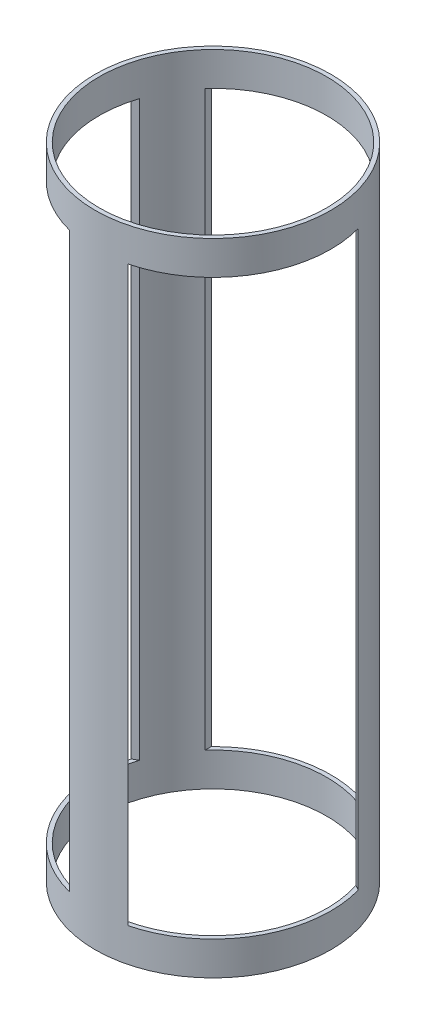
ISO-10303-21;
HEADER;
FILE_DESCRIPTION(('STEP AP214'),'2;1');
FILE_NAME('part.step','',(''),(''),'','','');
FILE_SCHEMA(('AUTOMOTIVE_DESIGN { 1 0 10303 214 1 1 1 1 }'));
ENDSEC;
DATA;
#1=APPLICATION_CONTEXT('core data for automotive mechanical design processes');
#2=APPLICATION_PROTOCOL_DEFINITION('international standard','automotive_design',2000,#1);
#3=PRODUCT_CONTEXT('',#1,'mechanical');
#4=PRODUCT('Part','Part','',(#3));
#5=PRODUCT_RELATED_PRODUCT_CATEGORY('part','',(#4));
#6=PRODUCT_DEFINITION_FORMATION('','',#4);
#7=PRODUCT_DEFINITION_CONTEXT('part definition',#1,'design');
#8=PRODUCT_DEFINITION('design','',#6,#7);
#9=PRODUCT_DEFINITION_SHAPE('','',#8);
#10=(LENGTH_UNIT() NAMED_UNIT(*) SI_UNIT(.MILLI.,.METRE.));
#11=(NAMED_UNIT(*) PLANE_ANGLE_UNIT() SI_UNIT($,.RADIAN.));
#12=(NAMED_UNIT(*) SI_UNIT($,.STERADIAN.) SOLID_ANGLE_UNIT());
#13=UNCERTAINTY_MEASURE_WITH_UNIT(LENGTH_MEASURE(1.E-05),#10,'distance_accuracy_value','');
#14=(GEOMETRIC_REPRESENTATION_CONTEXT(3) GLOBAL_UNCERTAINTY_ASSIGNED_CONTEXT((#13)) GLOBAL_UNIT_ASSIGNED_CONTEXT((#10,
#11,#12)) REPRESENTATION_CONTEXT('',''));
#15=CARTESIAN_POINT('',(0.,0.,0.));
#16=DIRECTION('',(0.,0.,1.));
#17=DIRECTION('',(1.,0.,0.));
#18=AXIS2_PLACEMENT_3D('',#15,#16,#17);
#19=CARTESIAN_POINT('',(0.,241.427,0.));
#20=DIRECTION('',(0.,1.,0.));
#21=DIRECTION('',(0.,0.,1.));
#22=AXIS2_PLACEMENT_3D('',#19,#20,#21);
#23=PLANE('',#22);
#24=CARTESIAN_POINT('',(0.,241.427,0.));
#25=DIRECTION('',(0.,1.,0.));
#26=DIRECTION('',(0.,0.,1.));
#27=AXIS2_PLACEMENT_3D('',#24,#25,#26);
#28=CIRCLE('',#27,88.9);
#29=CARTESIAN_POINT('',(0.,241.427,88.9));
#30=VERTEX_POINT('',#29);
#31=EDGE_CURVE('E226',#30,#30,#28,.T.);
#32=ORIENTED_EDGE('',*,*,#31,.T.);
#33=EDGE_LOOP('',(#32));
#34=FACE_BOUND('',#33,.T.);
#35=CARTESIAN_POINT('',(0.,241.427,0.));
#36=DIRECTION('',(0.,1.,0.));
#37=DIRECTION('',(0.,0.,1.));
#38=AXIS2_PLACEMENT_3D('',#35,#36,#37);
#39=CIRCLE('',#38,85.725);
#40=CARTESIAN_POINT('',(0.,241.427,85.725));
#41=VERTEX_POINT('',#40);
#42=EDGE_CURVE('E220',#41,#41,#39,.T.);
#43=ORIENTED_EDGE('',*,*,#42,.F.);
#44=EDGE_LOOP('',(#43));
#45=FACE_BOUND('',#44,.T.);
#46=ADVANCED_FACE('F41',(#34,#45),#23,.T.);
#47=CARTESIAN_POINT('',(0.,-241.427,0.));
#48=DIRECTION('',(0.,1.,0.));
#49=DIRECTION('',(0.,0.,1.));
#50=AXIS2_PLACEMENT_3D('',#47,#48,#49);
#51=PLANE('',#50);
#52=CARTESIAN_POINT('',(0.,-241.427,0.));
#53=DIRECTION('',(0.,1.,0.));
#54=DIRECTION('',(0.,0.,1.));
#55=AXIS2_PLACEMENT_3D('',#52,#53,#54);
#56=CIRCLE('',#55,88.9);
#57=CARTESIAN_POINT('',(0.,-241.427,88.9));
#58=VERTEX_POINT('',#57);
#59=EDGE_CURVE('E223',#58,#58,#56,.T.);
#60=ORIENTED_EDGE('',*,*,#59,.F.);
#61=EDGE_LOOP('',(#60));
#62=FACE_BOUND('',#61,.T.);
#63=CARTESIAN_POINT('',(0.,-241.427,0.));
#64=DIRECTION('',(0.,1.,0.));
#65=DIRECTION('',(0.,0.,1.));
#66=AXIS2_PLACEMENT_3D('',#63,#64,#65);
#67=CIRCLE('',#66,85.725);
#68=CARTESIAN_POINT('',(0.,-241.427,85.725));
#69=VERTEX_POINT('',#68);
#70=EDGE_CURVE('E200',#69,#69,#67,.T.);
#71=ORIENTED_EDGE('',*,*,#70,.T.);
#72=EDGE_LOOP('',(#71));
#73=FACE_BOUND('',#72,.T.);
#74=ADVANCED_FACE('F256',(#62,#73),#51,.F.);
#75=CARTESIAN_POINT('',(0.,241.427,0.));
#76=DIRECTION('',(0.,-1.,0.));
#77=DIRECTION('',(0.,0.,-1.));
#78=AXIS2_PLACEMENT_3D('',#75,#76,#77);
#79=CYLINDRICAL_SURFACE('',#78,88.9);
#80=CARTESIAN_POINT('',(0.,-216.027,0.));
#81=DIRECTION('',(0.,-1.,0.));
#82=DIRECTION('',(0.866025403784436,0.,0.500000000000004));
#83=AXIS2_PLACEMENT_3D('',#80,#81,#82);
#84=CIRCLE('',#83,88.9);
#85=CARTESIAN_POINT('',(22.1315367264145,-216.027,86.1011328736583));
#86=VERTEX_POINT('',#85);
#87=CARTESIAN_POINT('',(85.631536726415,-216.027,-23.8840934069651));
#88=VERTEX_POINT('',#87);
#89=EDGE_CURVE('E162',#86,#88,#84,.F.);
#90=ORIENTED_EDGE('',*,*,#89,.F.);
#91=DIRECTION('',(0.,-1.,0.));
#92=VECTOR('',#91,1.);
#93=CARTESIAN_POINT('',(22.1315367264145,241.427,86.1011328736583));
#94=LINE('',#93,#92);
#95=CARTESIAN_POINT('',(22.1315367264145,216.027,86.1011328736583));
#96=VERTEX_POINT('',#95);
#97=EDGE_CURVE('E167',#96,#86,#94,.T.);
#98=ORIENTED_EDGE('',*,*,#97,.F.);
#99=CARTESIAN_POINT('',(0.,216.027,0.));
#100=DIRECTION('',(0.,1.,0.));
#101=DIRECTION('',(-0.866025403784436,0.,-0.500000000000004));
#102=AXIS2_PLACEMENT_3D('',#99,#100,#101);
#103=CIRCLE('',#102,88.9);
#104=CARTESIAN_POINT('',(85.631536726415,216.027,-23.8840934069651));
#105=VERTEX_POINT('',#104);
#106=EDGE_CURVE('E141',#105,#96,#103,.F.);
#107=ORIENTED_EDGE('',*,*,#106,.F.);
#108=DIRECTION('',(0.,-1.,0.));
#109=VECTOR('',#108,1.);
#110=CARTESIAN_POINT('',(85.631536726415,241.427,-23.8840934069651));
#111=LINE('',#110,#109);
#112=EDGE_CURVE('E56',#88,#105,#111,.F.);
#113=ORIENTED_EDGE('',*,*,#112,.F.);
#114=EDGE_LOOP('',(#90,#98,#107,#113));
#115=FACE_BOUND('',#114,.T.);
#116=CARTESIAN_POINT('',(0.,-216.027,0.));
#117=DIRECTION('',(0.,-1.,0.));
#118=DIRECTION('',(-0.866025403784443,0.,0.499999999999992));
#119=AXIS2_PLACEMENT_3D('',#116,#117,#118);
#120=CIRCLE('',#119,88.9);
#121=CARTESIAN_POINT('',(-85.6315367264147,-216.027,-23.8840934069663));
#122=VERTEX_POINT('',#121);
#123=CARTESIAN_POINT('',(-22.1315367264157,-216.027,86.101132873658));
#124=VERTEX_POINT('',#123);
#125=EDGE_CURVE('E191',#122,#124,#120,.F.);
#126=ORIENTED_EDGE('',*,*,#125,.F.);
#127=DIRECTION('',(0.,-1.,0.));
#128=VECTOR('',#127,1.);
#129=CARTESIAN_POINT('',(-85.6315367264147,241.427,-23.8840934069663));
#130=LINE('',#129,#128);
#131=CARTESIAN_POINT('',(-85.6315367264147,216.027,-23.8840934069663));
#132=VERTEX_POINT('',#131);
#133=EDGE_CURVE('E142',#132,#122,#130,.T.);
#134=ORIENTED_EDGE('',*,*,#133,.F.);
#135=CARTESIAN_POINT('',(0.,216.027,0.));
#136=DIRECTION('',(0.,1.,0.));
#137=DIRECTION('',(0.866025403784443,0.,-0.499999999999992));
#138=AXIS2_PLACEMENT_3D('',#135,#136,#137);
#139=CIRCLE('',#138,88.9);
#140=CARTESIAN_POINT('',(-22.1315367264157,216.027,86.101132873658));
#141=VERTEX_POINT('',#140);
#142=EDGE_CURVE('E173',#141,#132,#139,.F.);
#143=ORIENTED_EDGE('',*,*,#142,.F.);
#144=DIRECTION('',(0.,-1.,0.));
#145=VECTOR('',#144,1.);
#146=CARTESIAN_POINT('',(-22.1315367264157,241.427,86.101132873658));
#147=LINE('',#146,#145);
#148=EDGE_CURVE('E64',#124,#141,#147,.F.);
#149=ORIENTED_EDGE('',*,*,#148,.F.);
#150=EDGE_LOOP('',(#126,#134,#143,#149));
#151=FACE_BOUND('',#150,.T.);
#152=CARTESIAN_POINT('',(0.,-216.027,0.));
#153=DIRECTION('',(0.,-1.,0.));
#154=DIRECTION('',(0.,0.,-1.));
#155=AXIS2_PLACEMENT_3D('',#152,#153,#154);
#156=CIRCLE('',#155,88.9);
#157=CARTESIAN_POINT('',(63.5,-216.027,-62.2170394666927));
#158=VERTEX_POINT('',#157);
#159=CARTESIAN_POINT('',(-63.5,-216.027,-62.2170394666927));
#160=VERTEX_POINT('',#159);
#161=EDGE_CURVE('E201',#158,#160,#156,.F.);
#162=ORIENTED_EDGE('',*,*,#161,.F.);
#163=DIRECTION('',(0.,-1.,0.));
#164=VECTOR('',#163,1.);
#165=CARTESIAN_POINT('',(63.5,241.427,-62.2170394666927));
#166=LINE('',#165,#164);
#167=CARTESIAN_POINT('',(63.5,216.027,-62.2170394666927));
#168=VERTEX_POINT('',#167);
#169=EDGE_CURVE('E204',#168,#158,#166,.T.);
#170=ORIENTED_EDGE('',*,*,#169,.F.);
#171=CARTESIAN_POINT('',(0.,216.027,0.));
#172=DIRECTION('',(0.,1.,0.));
#173=DIRECTION('',(0.,0.,1.));
#174=AXIS2_PLACEMENT_3D('',#171,#172,#173);
#175=CIRCLE('',#174,88.9);
#176=CARTESIAN_POINT('',(-63.5,216.027,-62.2170394666927));
#177=VERTEX_POINT('',#176);
#178=EDGE_CURVE('E207',#177,#168,#175,.F.);
#179=ORIENTED_EDGE('',*,*,#178,.F.);
#180=DIRECTION('',(0.,-1.,0.));
#181=VECTOR('',#180,1.);
#182=CARTESIAN_POINT('',(-63.5,241.427,-62.2170394666927));
#183=LINE('',#182,#181);
#184=EDGE_CURVE('E198',#160,#177,#183,.F.);
#185=ORIENTED_EDGE('',*,*,#184,.F.);
#186=EDGE_LOOP('',(#162,#170,#179,#185));
#187=FACE_BOUND('',#186,.T.);
#188=ORIENTED_EDGE('',*,*,#31,.F.);
#189=EDGE_LOOP('',(#188));
#190=FACE_BOUND('',#189,.T.);
#191=ORIENTED_EDGE('',*,*,#59,.T.);
#192=EDGE_LOOP('',(#191));
#193=FACE_BOUND('',#192,.T.);
#194=ADVANCED_FACE('F43',(#115,#151,#187,#190,#193),#79,.T.);
#195=CARTESIAN_POINT('',(0.,241.427,0.));
#196=DIRECTION('',(0.,-1.,0.));
#197=DIRECTION('',(0.,0.,-1.));
#198=AXIS2_PLACEMENT_3D('',#195,#196,#197);
#199=CYLINDRICAL_SURFACE('',#198,85.725);
#200=DIRECTION('',(0.,-1.,0.));
#201=VECTOR('',#200,1.);
#202=CARTESIAN_POINT('',(18.1237828798855,241.427,83.787255111519));
#203=LINE('',#202,#201);
#204=CARTESIAN_POINT('',(18.1237828798855,-216.027,83.787255111519));
#205=VERTEX_POINT('',#204);
#206=CARTESIAN_POINT('',(18.1237828798855,216.027,83.787255111519));
#207=VERTEX_POINT('',#206);
#208=EDGE_CURVE('E165',#205,#207,#203,.F.);
#209=ORIENTED_EDGE('',*,*,#208,.F.);
#210=CARTESIAN_POINT('',(0.,-216.027,0.));
#211=DIRECTION('',(0.,-1.,0.));
#212=DIRECTION('',(0.866025403784436,0.,0.500000000000004));
#213=AXIS2_PLACEMENT_3D('',#210,#211,#212);
#214=CIRCLE('',#213,85.725);
#215=CARTESIAN_POINT('',(81.623782879886,-216.027,-26.1979711691044));
#216=VERTEX_POINT('',#215);
#217=EDGE_CURVE('E151',#216,#205,#214,.T.);
#218=ORIENTED_EDGE('',*,*,#217,.F.);
#219=DIRECTION('',(0.,-1.,0.));
#220=VECTOR('',#219,1.);
#221=CARTESIAN_POINT('',(81.623782879886,241.427,-26.1979711691044));
#222=LINE('',#221,#220);
#223=CARTESIAN_POINT('',(81.623782879886,216.027,-26.1979711691044));
#224=VERTEX_POINT('',#223);
#225=EDGE_CURVE('E145',#224,#216,#222,.T.);
#226=ORIENTED_EDGE('',*,*,#225,.F.);
#227=CARTESIAN_POINT('',(0.,216.027,0.));
#228=DIRECTION('',(0.,1.,0.));
#229=DIRECTION('',(-0.866025403784436,0.,-0.500000000000004));
#230=AXIS2_PLACEMENT_3D('',#227,#228,#229);
#231=CIRCLE('',#230,85.725);
#232=EDGE_CURVE('E132',#207,#224,#231,.T.);
#233=ORIENTED_EDGE('',*,*,#232,.F.);
#234=EDGE_LOOP('',(#209,#218,#226,#233));
#235=FACE_BOUND('',#234,.T.);
#236=DIRECTION('',(0.,-1.,0.));
#237=VECTOR('',#236,1.);
#238=CARTESIAN_POINT('',(-81.6237828798856,241.427,-26.1979711691055));
#239=LINE('',#238,#237);
#240=CARTESIAN_POINT('',(-81.6237828798856,-216.027,-26.1979711691055));
#241=VERTEX_POINT('',#240);
#242=CARTESIAN_POINT('',(-81.6237828798857,216.027,-26.1979711691055));
#243=VERTEX_POINT('',#242);
#244=EDGE_CURVE('E194',#241,#243,#239,.F.);
#245=ORIENTED_EDGE('',*,*,#244,.F.);
#246=CARTESIAN_POINT('',(0.,-216.027,0.));
#247=DIRECTION('',(0.,-1.,0.));
#248=DIRECTION('',(-0.866025403784443,0.,0.499999999999992));
#249=AXIS2_PLACEMENT_3D('',#246,#247,#248);
#250=CIRCLE('',#249,85.725);
#251=CARTESIAN_POINT('',(-18.1237828798867,-216.027,83.7872551115187));
#252=VERTEX_POINT('',#251);
#253=EDGE_CURVE('E186',#252,#241,#250,.T.);
#254=ORIENTED_EDGE('',*,*,#253,.F.);
#255=DIRECTION('',(0.,-1.,0.));
#256=VECTOR('',#255,1.);
#257=CARTESIAN_POINT('',(-18.1237828798867,241.427,83.7872551115187));
#258=LINE('',#257,#256);
#259=CARTESIAN_POINT('',(-18.1237828798867,216.027,83.7872551115187));
#260=VERTEX_POINT('',#259);
#261=EDGE_CURVE('E180',#260,#252,#258,.T.);
#262=ORIENTED_EDGE('',*,*,#261,.F.);
#263=CARTESIAN_POINT('',(0.,216.027,0.));
#264=DIRECTION('',(0.,1.,0.));
#265=DIRECTION('',(0.866025403784443,0.,-0.499999999999992));
#266=AXIS2_PLACEMENT_3D('',#263,#264,#265);
#267=CIRCLE('',#266,85.725);
#268=EDGE_CURVE('E171',#243,#260,#267,.T.);
#269=ORIENTED_EDGE('',*,*,#268,.F.);
#270=EDGE_LOOP('',(#245,#254,#262,#269));
#271=FACE_BOUND('',#270,.T.);
#272=DIRECTION('',(0.,-1.,0.));
#273=VECTOR('',#272,1.);
#274=CARTESIAN_POINT('',(63.5,241.427,-57.5892839424141));
#275=LINE('',#274,#273);
#276=CARTESIAN_POINT('',(63.5,-216.027,-57.5892839424141));
#277=VERTEX_POINT('',#276);
#278=CARTESIAN_POINT('',(63.5,216.027,-57.5892839424141));
#279=VERTEX_POINT('',#278);
#280=EDGE_CURVE('E11',#277,#279,#275,.F.);
#281=ORIENTED_EDGE('',*,*,#280,.F.);
#282=CARTESIAN_POINT('',(0.,-216.027,0.));
#283=DIRECTION('',(0.,-1.,0.));
#284=DIRECTION('',(0.,0.,-1.));
#285=AXIS2_PLACEMENT_3D('',#282,#283,#284);
#286=CIRCLE('',#285,85.725);
#287=CARTESIAN_POINT('',(-63.5,-216.027,-57.5892839424141));
#288=VERTEX_POINT('',#287);
#289=EDGE_CURVE('E49',#288,#277,#286,.T.);
#290=ORIENTED_EDGE('',*,*,#289,.F.);
#291=DIRECTION('',(0.,-1.,0.));
#292=VECTOR('',#291,1.);
#293=CARTESIAN_POINT('',(-63.5,241.427,-57.5892839424141));
#294=LINE('',#293,#292);
#295=CARTESIAN_POINT('',(-63.5,216.027,-57.5892839424141));
#296=VERTEX_POINT('',#295);
#297=EDGE_CURVE('E233',#296,#288,#294,.T.);
#298=ORIENTED_EDGE('',*,*,#297,.F.);
#299=CARTESIAN_POINT('',(0.,216.027,0.));
#300=DIRECTION('',(0.,1.,0.));
#301=DIRECTION('',(0.,0.,1.));
#302=AXIS2_PLACEMENT_3D('',#299,#300,#301);
#303=CIRCLE('',#302,85.725);
#304=EDGE_CURVE('E229',#279,#296,#303,.T.);
#305=ORIENTED_EDGE('',*,*,#304,.F.);
#306=EDGE_LOOP('',(#281,#290,#298,#305));
#307=FACE_BOUND('',#306,.T.);
#308=ORIENTED_EDGE('',*,*,#42,.T.);
#309=EDGE_LOOP('',(#308));
#310=FACE_BOUND('',#309,.T.);
#311=ORIENTED_EDGE('',*,*,#70,.F.);
#312=EDGE_LOOP('',(#311));
#313=FACE_BOUND('',#312,.T.);
#314=ADVANCED_FACE('F149',(#235,#271,#307,#310,#313),#199,.F.);
#315=CARTESIAN_POINT('',(63.5,-216.027,-88.901));
#316=DIRECTION('',(1.,0.,0.));
#317=DIRECTION('',(0.,0.,-1.));
#318=AXIS2_PLACEMENT_3D('',#315,#316,#317);
#319=PLANE('',#318);
#320=ORIENTED_EDGE('',*,*,#280,.T.);
#321=DIRECTION('',(0.,0.,1.));
#322=VECTOR('',#321,1.);
#323=CARTESIAN_POINT('',(63.5,216.027,-88.901));
#324=LINE('',#323,#322);
#325=EDGE_CURVE('E170',#168,#279,#324,.T.);
#326=ORIENTED_EDGE('',*,*,#325,.F.);
#327=ORIENTED_EDGE('',*,*,#169,.T.);
#328=DIRECTION('',(0.,0.,1.));
#329=VECTOR('',#328,1.);
#330=CARTESIAN_POINT('',(63.5,-216.027,-88.901));
#331=LINE('',#330,#329);
#332=EDGE_CURVE('E211',#158,#277,#331,.T.);
#333=ORIENTED_EDGE('',*,*,#332,.T.);
#334=EDGE_LOOP('',(#320,#326,#327,#333));
#335=FACE_BOUND('',#334,.T.);
#336=ADVANCED_FACE('F241',(#335),#319,.F.);
#337=CARTESIAN_POINT('',(-63.5,-216.027,-88.901));
#338=DIRECTION('',(0.,-1.,0.));
#339=DIRECTION('',(0.,0.,-1.));
#340=AXIS2_PLACEMENT_3D('',#337,#338,#339);
#341=PLANE('',#340);
#342=ORIENTED_EDGE('',*,*,#289,.T.);
#343=ORIENTED_EDGE('',*,*,#332,.F.);
#344=ORIENTED_EDGE('',*,*,#161,.T.);
#345=DIRECTION('',(0.,0.,1.));
#346=VECTOR('',#345,1.);
#347=CARTESIAN_POINT('',(-63.5,-216.027,-88.901));
#348=LINE('',#347,#346);
#349=EDGE_CURVE('E214',#160,#288,#348,.T.);
#350=ORIENTED_EDGE('',*,*,#349,.T.);
#351=EDGE_LOOP('',(#342,#343,#344,#350));
#352=FACE_BOUND('',#351,.T.);
#353=ADVANCED_FACE('F236',(#352),#341,.F.);
#354=CARTESIAN_POINT('',(-63.5,-216.027,-88.901));
#355=DIRECTION('',(-1.,0.,0.));
#356=DIRECTION('',(0.,0.,1.));
#357=AXIS2_PLACEMENT_3D('',#354,#355,#356);
#358=PLANE('',#357);
#359=ORIENTED_EDGE('',*,*,#297,.T.);
#360=ORIENTED_EDGE('',*,*,#349,.F.);
#361=ORIENTED_EDGE('',*,*,#184,.T.);
#362=DIRECTION('',(0.,0.,1.));
#363=VECTOR('',#362,1.);
#364=CARTESIAN_POINT('',(-63.5,216.027,-88.901));
#365=LINE('',#364,#363);
#366=EDGE_CURVE('E210',#177,#296,#365,.T.);
#367=ORIENTED_EDGE('',*,*,#366,.T.);
#368=EDGE_LOOP('',(#359,#360,#361,#367));
#369=FACE_BOUND('',#368,.T.);
#370=ADVANCED_FACE('F251',(#369),#358,.F.);
#371=CARTESIAN_POINT('',(-63.5,216.027,-88.901));
#372=DIRECTION('',(0.,1.,0.));
#373=DIRECTION('',(0.,0.,1.));
#374=AXIS2_PLACEMENT_3D('',#371,#372,#373);
#375=PLANE('',#374);
#376=ORIENTED_EDGE('',*,*,#304,.T.);
#377=ORIENTED_EDGE('',*,*,#366,.F.);
#378=ORIENTED_EDGE('',*,*,#178,.T.);
#379=ORIENTED_EDGE('',*,*,#325,.T.);
#380=EDGE_LOOP('',(#376,#377,#378,#379));
#381=FACE_BOUND('',#380,.T.);
#382=ADVANCED_FACE('F248',(#381),#375,.F.);
#383=CARTESIAN_POINT('',(-108.74052442184,-216.027,-10.5421131403129));
#384=DIRECTION('',(-0.499999999999992,0.,-0.866025403784443));
#385=DIRECTION('',(-0.866025403784443,0.,0.499999999999992));
#386=AXIS2_PLACEMENT_3D('',#383,#384,#385);
#387=PLANE('',#386);
#388=ORIENTED_EDGE('',*,*,#244,.T.);
#389=DIRECTION('',(0.866025403784443,0.,-0.499999999999992));
#390=VECTOR('',#389,1.);
#391=CARTESIAN_POINT('',(-108.74052442184,216.027,-10.5421131403129));
#392=LINE('',#391,#390);
#393=EDGE_CURVE('E177',#132,#243,#392,.T.);
#394=ORIENTED_EDGE('',*,*,#393,.F.);
#395=ORIENTED_EDGE('',*,*,#133,.T.);
#396=DIRECTION('',(0.866025403784443,0.,-0.499999999999992));
#397=VECTOR('',#396,1.);
#398=CARTESIAN_POINT('',(-108.74052442184,-216.027,-10.5421131403129));
#399=LINE('',#398,#397);
#400=EDGE_CURVE('E188',#122,#241,#399,.T.);
#401=ORIENTED_EDGE('',*,*,#400,.T.);
#402=EDGE_LOOP('',(#388,#394,#395,#401));
#403=FACE_BOUND('',#402,.T.);
#404=ADVANCED_FACE('F303',(#403),#387,.F.);
#405=CARTESIAN_POINT('',(-45.2405244218413,-216.027,99.4431131403114));
#406=DIRECTION('',(0.,-1.,0.));
#407=DIRECTION('',(-0.866025403784443,0.,0.499999999999992));
#408=AXIS2_PLACEMENT_3D('',#405,#406,#407);
#409=PLANE('',#408);
#410=ORIENTED_EDGE('',*,*,#253,.T.);
#411=ORIENTED_EDGE('',*,*,#400,.F.);
#412=ORIENTED_EDGE('',*,*,#125,.T.);
#413=DIRECTION('',(0.866025403784443,0.,-0.499999999999992));
#414=VECTOR('',#413,1.);
#415=CARTESIAN_POINT('',(-45.2405244218413,-216.027,99.4431131403114));
#416=LINE('',#415,#414);
#417=EDGE_CURVE('E182',#124,#252,#416,.T.);
#418=ORIENTED_EDGE('',*,*,#417,.T.);
#419=EDGE_LOOP('',(#410,#411,#412,#418));
#420=FACE_BOUND('',#419,.T.);
#421=ADVANCED_FACE('F308',(#420),#409,.F.);
#422=CARTESIAN_POINT('',(-45.2405244218413,-216.027,99.4431131403114));
#423=DIRECTION('',(0.499999999999992,0.,0.866025403784443));
#424=DIRECTION('',(0.866025403784443,0.,-0.499999999999992));
#425=AXIS2_PLACEMENT_3D('',#422,#423,#424);
#426=PLANE('',#425);
#427=ORIENTED_EDGE('',*,*,#261,.T.);
#428=ORIENTED_EDGE('',*,*,#417,.F.);
#429=ORIENTED_EDGE('',*,*,#148,.T.);
#430=DIRECTION('',(0.866025403784443,0.,-0.499999999999992));
#431=VECTOR('',#430,1.);
#432=CARTESIAN_POINT('',(-45.2405244218413,216.027,99.4431131403114));
#433=LINE('',#432,#431);
#434=EDGE_CURVE('E175',#141,#260,#433,.T.);
#435=ORIENTED_EDGE('',*,*,#434,.T.);
#436=EDGE_LOOP('',(#427,#428,#429,#435));
#437=FACE_BOUND('',#436,.T.);
#438=ADVANCED_FACE('F318',(#437),#426,.F.);
#439=CARTESIAN_POINT('',(-45.2405244218413,216.027,99.4431131403114));
#440=DIRECTION('',(0.,1.,0.));
#441=DIRECTION('',(0.866025403784443,0.,-0.499999999999992));
#442=AXIS2_PLACEMENT_3D('',#439,#440,#441);
#443=PLANE('',#442);
#444=ORIENTED_EDGE('',*,*,#268,.T.);
#445=ORIENTED_EDGE('',*,*,#434,.F.);
#446=ORIENTED_EDGE('',*,*,#142,.T.);
#447=ORIENTED_EDGE('',*,*,#393,.T.);
#448=EDGE_LOOP('',(#444,#445,#446,#447));
#449=FACE_BOUND('',#448,.T.);
#450=ADVANCED_FACE('F328',(#449),#443,.F.);
#451=CARTESIAN_POINT('',(45.2405244218399,-216.027,99.4431131403121));
#452=DIRECTION('',(-0.500000000000004,0.,0.866025403784436));
#453=DIRECTION('',(0.866025403784436,0.,0.500000000000004));
#454=AXIS2_PLACEMENT_3D('',#451,#452,#453);
#455=PLANE('',#454);
#456=ORIENTED_EDGE('',*,*,#208,.T.);
#457=DIRECTION('',(-0.866025403784436,0.,-0.500000000000004));
#458=VECTOR('',#457,1.);
#459=CARTESIAN_POINT('',(45.2405244218399,216.027,99.4431131403121));
#460=LINE('',#459,#458);
#461=EDGE_CURVE('E137',#96,#207,#460,.T.);
#462=ORIENTED_EDGE('',*,*,#461,.F.);
#463=ORIENTED_EDGE('',*,*,#97,.T.);
#464=DIRECTION('',(-0.866025403784436,0.,-0.500000000000004));
#465=VECTOR('',#464,1.);
#466=CARTESIAN_POINT('',(45.2405244218399,-216.027,99.4431131403121));
#467=LINE('',#466,#465);
#468=EDGE_CURVE('E159',#86,#205,#467,.T.);
#469=ORIENTED_EDGE('',*,*,#468,.T.);
#470=EDGE_LOOP('',(#456,#462,#463,#469));
#471=FACE_BOUND('',#470,.T.);
#472=ADVANCED_FACE('F337',(#471),#455,.F.);
#473=CARTESIAN_POINT('',(108.74052442184,-216.027,-10.5421131403114));
#474=DIRECTION('',(0.,-1.,0.));
#475=DIRECTION('',(0.866025403784436,0.,0.500000000000004));
#476=AXIS2_PLACEMENT_3D('',#473,#474,#475);
#477=PLANE('',#476);
#478=ORIENTED_EDGE('',*,*,#217,.T.);
#479=ORIENTED_EDGE('',*,*,#468,.F.);
#480=ORIENTED_EDGE('',*,*,#89,.T.);
#481=DIRECTION('',(-0.866025403784436,0.,-0.500000000000004));
#482=VECTOR('',#481,1.);
#483=CARTESIAN_POINT('',(108.74052442184,-216.027,-10.5421131403114));
#484=LINE('',#483,#482);
#485=EDGE_CURVE('E152',#88,#216,#484,.T.);
#486=ORIENTED_EDGE('',*,*,#485,.T.);
#487=EDGE_LOOP('',(#478,#479,#480,#486));
#488=FACE_BOUND('',#487,.T.);
#489=ADVANCED_FACE('F347',(#488),#477,.F.);
#490=CARTESIAN_POINT('',(108.74052442184,-216.027,-10.5421131403114));
#491=DIRECTION('',(0.500000000000004,0.,-0.866025403784436));
#492=DIRECTION('',(-0.866025403784436,0.,-0.500000000000004));
#493=AXIS2_PLACEMENT_3D('',#490,#491,#492);
#494=PLANE('',#493);
#495=ORIENTED_EDGE('',*,*,#225,.T.);
#496=ORIENTED_EDGE('',*,*,#485,.F.);
#497=ORIENTED_EDGE('',*,*,#112,.T.);
#498=DIRECTION('',(-0.866025403784436,0.,-0.500000000000004));
#499=VECTOR('',#498,1.);
#500=CARTESIAN_POINT('',(108.74052442184,216.027,-10.5421131403114));
#501=LINE('',#500,#499);
#502=EDGE_CURVE('E134',#105,#224,#501,.T.);
#503=ORIENTED_EDGE('',*,*,#502,.T.);
#504=EDGE_LOOP('',(#495,#496,#497,#503));
#505=FACE_BOUND('',#504,.T.);
#506=ADVANCED_FACE('F144',(#505),#494,.F.);
#507=CARTESIAN_POINT('',(108.74052442184,216.027,-10.5421131403114));
#508=DIRECTION('',(0.,1.,0.));
#509=DIRECTION('',(-0.866025403784436,0.,-0.500000000000004));
#510=AXIS2_PLACEMENT_3D('',#507,#508,#509);
#511=PLANE('',#510);
#512=ORIENTED_EDGE('',*,*,#232,.T.);
#513=ORIENTED_EDGE('',*,*,#502,.F.);
#514=ORIENTED_EDGE('',*,*,#106,.T.);
#515=ORIENTED_EDGE('',*,*,#461,.T.);
#516=EDGE_LOOP('',(#512,#513,#514,#515));
#517=FACE_BOUND('',#516,.T.);
#518=ADVANCED_FACE('F133',(#517),#511,.F.);
#519=CLOSED_SHELL('',(#46,#74,#194,#314,#336,#353,#370,#382,#404,#421,#438,#450,#472,#489,#506,#518));
#520=MANIFOLD_SOLID_BREP('B2',#519);
#521=ADVANCED_BREP_SHAPE_REPRESENTATION('',(#18,#520),#14);
#522=SHAPE_DEFINITION_REPRESENTATION(#9,#521);
ENDSEC;
END-ISO-10303-21;
